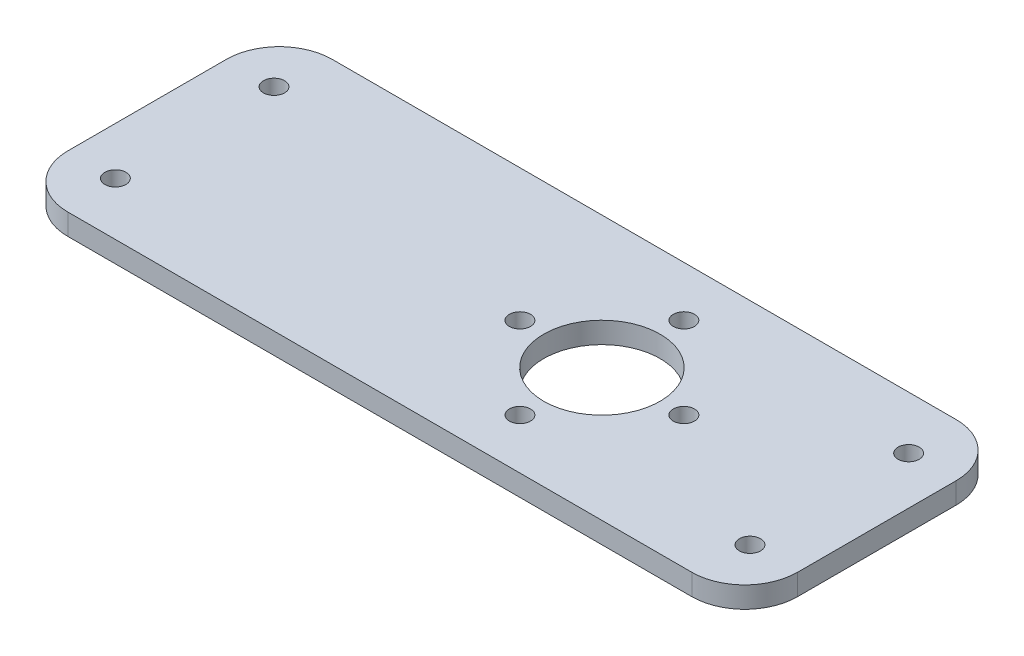
ISO-10303-21;
HEADER;
FILE_DESCRIPTION(('STEP AP214'),'2;1');
FILE_NAME('part.step','',(''),(''),'','','');
FILE_SCHEMA(('AUTOMOTIVE_DESIGN { 1 0 10303 214 1 1 1 1 }'));
ENDSEC;
DATA;
#1=APPLICATION_CONTEXT('core data for automotive mechanical design processes');
#2=APPLICATION_PROTOCOL_DEFINITION('international standard','automotive_design',2000,#1);
#3=PRODUCT_CONTEXT('',#1,'mechanical');
#4=PRODUCT('Part','Part','',(#3));
#5=PRODUCT_RELATED_PRODUCT_CATEGORY('part','',(#4));
#6=PRODUCT_DEFINITION_FORMATION('','',#4);
#7=PRODUCT_DEFINITION_CONTEXT('part definition',#1,'design');
#8=PRODUCT_DEFINITION('design','',#6,#7);
#9=PRODUCT_DEFINITION_SHAPE('','',#8);
#10=(LENGTH_UNIT() NAMED_UNIT(*) SI_UNIT(.MILLI.,.METRE.));
#11=(NAMED_UNIT(*) PLANE_ANGLE_UNIT() SI_UNIT($,.RADIAN.));
#12=(NAMED_UNIT(*) SI_UNIT($,.STERADIAN.) SOLID_ANGLE_UNIT());
#13=UNCERTAINTY_MEASURE_WITH_UNIT(LENGTH_MEASURE(1.E-05),#10,'distance_accuracy_value','');
#14=(GEOMETRIC_REPRESENTATION_CONTEXT(3) GLOBAL_UNCERTAINTY_ASSIGNED_CONTEXT((#13)) GLOBAL_UNIT_ASSIGNED_CONTEXT((#10,
#11,#12)) REPRESENTATION_CONTEXT('',''));
#15=CARTESIAN_POINT('',(0.,0.,0.));
#16=DIRECTION('',(0.,0.,1.));
#17=DIRECTION('',(1.,0.,0.));
#18=AXIS2_PLACEMENT_3D('',#15,#16,#17);
#19=CARTESIAN_POINT('',(0.,4.,25.));
#20=DIRECTION('',(0.,0.,1.));
#21=DIRECTION('',(1.,0.,0.));
#22=AXIS2_PLACEMENT_3D('',#19,#20,#21);
#23=PLANE('',#22);
#24=DIRECTION('',(-1.,0.,0.));
#25=VECTOR('',#24,1.);
#26=CARTESIAN_POINT('',(0.,4.,25.));
#27=LINE('',#26,#25);
#28=CARTESIAN_POINT('',(42.,4.,25.));
#29=VERTEX_POINT('',#28);
#30=CARTESIAN_POINT('',(-76.,4.,25.));
#31=VERTEX_POINT('',#30);
#32=EDGE_CURVE('E186',#29,#31,#27,.T.);
#33=ORIENTED_EDGE('',*,*,#32,.T.);
#34=DIRECTION('',(0.,1.,0.));
#35=VECTOR('',#34,1.);
#36=CARTESIAN_POINT('',(-76.,0.,25.));
#37=LINE('',#36,#35);
#38=CARTESIAN_POINT('',(-76.,0.,25.));
#39=VERTEX_POINT('',#38);
#40=EDGE_CURVE('E172',#31,#39,#37,.F.);
#41=ORIENTED_EDGE('',*,*,#40,.T.);
#42=DIRECTION('',(-1.,0.,0.));
#43=VECTOR('',#42,1.);
#44=CARTESIAN_POINT('',(0.,0.,25.));
#45=LINE('',#44,#43);
#46=CARTESIAN_POINT('',(42.,0.,25.));
#47=VERTEX_POINT('',#46);
#48=EDGE_CURVE('E138',#47,#39,#45,.T.);
#49=ORIENTED_EDGE('',*,*,#48,.F.);
#50=DIRECTION('',(0.,-1.,0.));
#51=VECTOR('',#50,1.);
#52=CARTESIAN_POINT('',(42.,4.,25.));
#53=LINE('',#52,#51);
#54=EDGE_CURVE('E169',#47,#29,#53,.F.);
#55=ORIENTED_EDGE('',*,*,#54,.T.);
#56=EDGE_LOOP('',(#33,#41,#49,#55));
#57=FACE_BOUND('',#56,.T.);
#58=ADVANCED_FACE('F40',(#57),#23,.T.);
#59=CARTESIAN_POINT('',(52.,4.,0.));
#60=DIRECTION('',(-1.,0.,0.));
#61=DIRECTION('',(0.,0.,1.));
#62=AXIS2_PLACEMENT_3D('',#59,#60,#61);
#63=PLANE('',#62);
#64=DIRECTION('',(0.,0.,-1.));
#65=VECTOR('',#64,1.);
#66=CARTESIAN_POINT('',(52.,4.,0.));
#67=LINE('',#66,#65);
#68=CARTESIAN_POINT('',(52.,4.,15.));
#69=VERTEX_POINT('',#68);
#70=CARTESIAN_POINT('',(52.,4.,-15.));
#71=VERTEX_POINT('',#70);
#72=EDGE_CURVE('E179',#69,#71,#67,.T.);
#73=ORIENTED_EDGE('',*,*,#72,.F.);
#74=DIRECTION('',(0.,-1.,0.));
#75=VECTOR('',#74,1.);
#76=CARTESIAN_POINT('',(52.,0.,15.));
#77=LINE('',#76,#75);
#78=CARTESIAN_POINT('',(52.,0.,15.));
#79=VERTEX_POINT('',#78);
#80=EDGE_CURVE('E11',#69,#79,#77,.T.);
#81=ORIENTED_EDGE('',*,*,#80,.T.);
#82=DIRECTION('',(0.,0.,-1.));
#83=VECTOR('',#82,1.);
#84=CARTESIAN_POINT('',(52.,0.,0.));
#85=LINE('',#84,#83);
#86=CARTESIAN_POINT('',(52.,0.,-15.));
#87=VERTEX_POINT('',#86);
#88=EDGE_CURVE('E131',#79,#87,#85,.T.);
#89=ORIENTED_EDGE('',*,*,#88,.T.);
#90=DIRECTION('',(0.,-1.,0.));
#91=VECTOR('',#90,1.);
#92=CARTESIAN_POINT('',(52.,4.,-15.));
#93=LINE('',#92,#91);
#94=EDGE_CURVE('E49',#87,#71,#93,.F.);
#95=ORIENTED_EDGE('',*,*,#94,.T.);
#96=EDGE_LOOP('',(#73,#81,#89,#95));
#97=FACE_BOUND('',#96,.T.);
#98=ADVANCED_FACE('F178',(#97),#63,.F.);
#99=CARTESIAN_POINT('',(15.5,4.,0.));
#100=DIRECTION('',(0.,-1.,0.));
#101=DIRECTION('',(0.,0.,-1.));
#102=AXIS2_PLACEMENT_3D('',#99,#100,#101);
#103=CYLINDRICAL_SURFACE('',#102,2.);
#104=CARTESIAN_POINT('',(15.5,4.,0.));
#105=DIRECTION('',(0.,1.,0.));
#106=DIRECTION('',(0.,0.,1.));
#107=AXIS2_PLACEMENT_3D('',#104,#105,#106);
#108=CIRCLE('',#107,2.);
#109=CARTESIAN_POINT('',(15.5,4.,2.));
#110=VERTEX_POINT('',#109);
#111=EDGE_CURVE('E192',#110,#110,#108,.T.);
#112=ORIENTED_EDGE('',*,*,#111,.T.);
#113=EDGE_LOOP('',(#112));
#114=FACE_BOUND('',#113,.T.);
#115=CARTESIAN_POINT('',(15.5,0.,0.));
#116=DIRECTION('',(0.,1.,0.));
#117=DIRECTION('',(0.,0.,1.));
#118=AXIS2_PLACEMENT_3D('',#115,#116,#117);
#119=CIRCLE('',#118,2.);
#120=CARTESIAN_POINT('',(15.5,0.,2.));
#121=VERTEX_POINT('',#120);
#122=EDGE_CURVE('E221',#121,#121,#119,.T.);
#123=ORIENTED_EDGE('',*,*,#122,.F.);
#124=EDGE_LOOP('',(#123));
#125=FACE_BOUND('',#124,.T.);
#126=ADVANCED_FACE('F273',(#114,#125),#103,.F.);
#127=CARTESIAN_POINT('',(0.,4.,0.));
#128=DIRECTION('',(0.,-1.,0.));
#129=DIRECTION('',(0.,0.,-1.));
#130=AXIS2_PLACEMENT_3D('',#127,#128,#129);
#131=CYLINDRICAL_SURFACE('',#130,10.9999999999999);
#132=CARTESIAN_POINT('',(0.,4.,0.));
#133=DIRECTION('',(0.,1.,0.));
#134=DIRECTION('',(0.,0.,1.));
#135=AXIS2_PLACEMENT_3D('',#132,#133,#134);
#136=CIRCLE('',#135,10.9999999999999);
#137=CARTESIAN_POINT('',(0.,4.,10.9999999999999));
#138=VERTEX_POINT('',#137);
#139=EDGE_CURVE('E266',#138,#138,#136,.T.);
#140=ORIENTED_EDGE('',*,*,#139,.T.);
#141=EDGE_LOOP('',(#140));
#142=FACE_BOUND('',#141,.T.);
#143=CARTESIAN_POINT('',(0.,0.,0.));
#144=DIRECTION('',(0.,1.,0.));
#145=DIRECTION('',(0.,0.,1.));
#146=AXIS2_PLACEMENT_3D('',#143,#144,#145);
#147=CIRCLE('',#146,10.9999999999999);
#148=CARTESIAN_POINT('',(0.,0.,10.9999999999999));
#149=VERTEX_POINT('',#148);
#150=EDGE_CURVE('E217',#149,#149,#147,.T.);
#151=ORIENTED_EDGE('',*,*,#150,.F.);
#152=EDGE_LOOP('',(#151));
#153=FACE_BOUND('',#152,.T.);
#154=ADVANCED_FACE('F300',(#142,#153),#131,.F.);
#155=CARTESIAN_POINT('',(43.,4.,-15.));
#156=DIRECTION('',(0.,-1.,0.));
#157=DIRECTION('',(0.,0.,-1.));
#158=AXIS2_PLACEMENT_3D('',#155,#156,#157);
#159=CYLINDRICAL_SURFACE('',#158,2.);
#160=CARTESIAN_POINT('',(43.,4.,-15.));
#161=DIRECTION('',(0.,1.,0.));
#162=DIRECTION('',(0.,0.,1.));
#163=AXIS2_PLACEMENT_3D('',#160,#161,#162);
#164=CIRCLE('',#163,2.);
#165=CARTESIAN_POINT('',(43.,4.,-13.));
#166=VERTEX_POINT('',#165);
#167=EDGE_CURVE('E262',#166,#166,#164,.T.);
#168=ORIENTED_EDGE('',*,*,#167,.T.);
#169=EDGE_LOOP('',(#168));
#170=FACE_BOUND('',#169,.T.);
#171=CARTESIAN_POINT('',(43.,0.,-15.));
#172=DIRECTION('',(0.,1.,0.));
#173=DIRECTION('',(0.,0.,1.));
#174=AXIS2_PLACEMENT_3D('',#171,#172,#173);
#175=CIRCLE('',#174,2.);
#176=CARTESIAN_POINT('',(43.,0.,-13.));
#177=VERTEX_POINT('',#176);
#178=EDGE_CURVE('E213',#177,#177,#175,.T.);
#179=ORIENTED_EDGE('',*,*,#178,.F.);
#180=EDGE_LOOP('',(#179));
#181=FACE_BOUND('',#180,.T.);
#182=ADVANCED_FACE('F303',(#170,#181),#159,.F.);
#183=CARTESIAN_POINT('',(43.,4.,15.));
#184=DIRECTION('',(0.,-1.,0.));
#185=DIRECTION('',(0.,0.,-1.));
#186=AXIS2_PLACEMENT_3D('',#183,#184,#185);
#187=CYLINDRICAL_SURFACE('',#186,2.);
#188=CARTESIAN_POINT('',(43.,4.,15.));
#189=DIRECTION('',(0.,1.,0.));
#190=DIRECTION('',(0.,0.,1.));
#191=AXIS2_PLACEMENT_3D('',#188,#189,#190);
#192=CIRCLE('',#191,2.);
#193=CARTESIAN_POINT('',(43.,4.,17.));
#194=VERTEX_POINT('',#193);
#195=EDGE_CURVE('E258',#194,#194,#192,.T.);
#196=ORIENTED_EDGE('',*,*,#195,.T.);
#197=EDGE_LOOP('',(#196));
#198=FACE_BOUND('',#197,.T.);
#199=CARTESIAN_POINT('',(43.,0.,15.));
#200=DIRECTION('',(0.,1.,0.));
#201=DIRECTION('',(0.,0.,1.));
#202=AXIS2_PLACEMENT_3D('',#199,#200,#201);
#203=CIRCLE('',#202,2.);
#204=CARTESIAN_POINT('',(43.,0.,17.));
#205=VERTEX_POINT('',#204);
#206=EDGE_CURVE('E209',#205,#205,#203,.T.);
#207=ORIENTED_EDGE('',*,*,#206,.F.);
#208=EDGE_LOOP('',(#207));
#209=FACE_BOUND('',#208,.T.);
#210=ADVANCED_FACE('F307',(#198,#209),#187,.F.);
#211=CARTESIAN_POINT('',(0.,4.,15.5));
#212=DIRECTION('',(0.,-1.,0.));
#213=DIRECTION('',(0.,0.,-1.));
#214=AXIS2_PLACEMENT_3D('',#211,#212,#213);
#215=CYLINDRICAL_SURFACE('',#214,2.);
#216=CARTESIAN_POINT('',(0.,4.,15.5));
#217=DIRECTION('',(0.,1.,0.));
#218=DIRECTION('',(0.,0.,1.));
#219=AXIS2_PLACEMENT_3D('',#216,#217,#218);
#220=CIRCLE('',#219,2.);
#221=CARTESIAN_POINT('',(0.,4.,17.5));
#222=VERTEX_POINT('',#221);
#223=EDGE_CURVE('E254',#222,#222,#220,.T.);
#224=ORIENTED_EDGE('',*,*,#223,.T.);
#225=EDGE_LOOP('',(#224));
#226=FACE_BOUND('',#225,.T.);
#227=CARTESIAN_POINT('',(0.,0.,15.5));
#228=DIRECTION('',(0.,1.,0.));
#229=DIRECTION('',(0.,0.,1.));
#230=AXIS2_PLACEMENT_3D('',#227,#228,#229);
#231=CIRCLE('',#230,2.);
#232=CARTESIAN_POINT('',(0.,0.,17.5));
#233=VERTEX_POINT('',#232);
#234=EDGE_CURVE('E205',#233,#233,#231,.T.);
#235=ORIENTED_EDGE('',*,*,#234,.F.);
#236=EDGE_LOOP('',(#235));
#237=FACE_BOUND('',#236,.T.);
#238=ADVANCED_FACE('F311',(#226,#237),#215,.F.);
#239=CARTESIAN_POINT('',(0.,4.,-15.5));
#240=DIRECTION('',(0.,-1.,0.));
#241=DIRECTION('',(0.,0.,-1.));
#242=AXIS2_PLACEMENT_3D('',#239,#240,#241);
#243=CYLINDRICAL_SURFACE('',#242,2.);
#244=CARTESIAN_POINT('',(0.,4.,-15.5));
#245=DIRECTION('',(0.,1.,0.));
#246=DIRECTION('',(0.,0.,1.));
#247=AXIS2_PLACEMENT_3D('',#244,#245,#246);
#248=CIRCLE('',#247,2.);
#249=CARTESIAN_POINT('',(0.,4.,-13.5));
#250=VERTEX_POINT('',#249);
#251=EDGE_CURVE('E136',#250,#250,#248,.T.);
#252=ORIENTED_EDGE('',*,*,#251,.T.);
#253=EDGE_LOOP('',(#252));
#254=FACE_BOUND('',#253,.T.);
#255=CARTESIAN_POINT('',(0.,0.,-15.5));
#256=DIRECTION('',(0.,1.,0.));
#257=DIRECTION('',(0.,0.,1.));
#258=AXIS2_PLACEMENT_3D('',#255,#256,#257);
#259=CIRCLE('',#258,2.);
#260=CARTESIAN_POINT('',(0.,0.,-13.5));
#261=VERTEX_POINT('',#260);
#262=EDGE_CURVE('E200',#261,#261,#259,.T.);
#263=ORIENTED_EDGE('',*,*,#262,.F.);
#264=EDGE_LOOP('',(#263));
#265=FACE_BOUND('',#264,.T.);
#266=ADVANCED_FACE('F315',(#254,#265),#243,.F.);
#267=CARTESIAN_POINT('',(-15.5,4.,0.));
#268=DIRECTION('',(0.,-1.,0.));
#269=DIRECTION('',(0.,0.,-1.));
#270=AXIS2_PLACEMENT_3D('',#267,#268,#269);
#271=CYLINDRICAL_SURFACE('',#270,2.);
#272=CARTESIAN_POINT('',(-15.5,4.,0.));
#273=DIRECTION('',(0.,1.,0.));
#274=DIRECTION('',(0.,0.,1.));
#275=AXIS2_PLACEMENT_3D('',#272,#273,#274);
#276=CIRCLE('',#275,2.);
#277=CARTESIAN_POINT('',(-15.5,4.,2.));
#278=VERTEX_POINT('',#277);
#279=EDGE_CURVE('E130',#278,#278,#276,.T.);
#280=ORIENTED_EDGE('',*,*,#279,.T.);
#281=EDGE_LOOP('',(#280));
#282=FACE_BOUND('',#281,.T.);
#283=CARTESIAN_POINT('',(-15.5,0.,0.));
#284=DIRECTION('',(0.,1.,0.));
#285=DIRECTION('',(0.,0.,1.));
#286=AXIS2_PLACEMENT_3D('',#283,#284,#285);
#287=CIRCLE('',#286,2.);
#288=CARTESIAN_POINT('',(-15.5,0.,2.));
#289=VERTEX_POINT('',#288);
#290=EDGE_CURVE('E196',#289,#289,#287,.T.);
#291=ORIENTED_EDGE('',*,*,#290,.F.);
#292=EDGE_LOOP('',(#291));
#293=FACE_BOUND('',#292,.T.);
#294=ADVANCED_FACE('F285',(#282,#293),#271,.F.);
#295=CARTESIAN_POINT('',(0.,4.,-25.));
#296=DIRECTION('',(0.,0.,1.));
#297=DIRECTION('',(1.,0.,0.));
#298=AXIS2_PLACEMENT_3D('',#295,#296,#297);
#299=PLANE('',#298);
#300=DIRECTION('',(-1.,0.,0.));
#301=VECTOR('',#300,1.);
#302=CARTESIAN_POINT('',(0.,0.,-25.));
#303=LINE('',#302,#301);
#304=CARTESIAN_POINT('',(42.,0.,-25.));
#305=VERTEX_POINT('',#304);
#306=CARTESIAN_POINT('',(-76.,0.,-25.));
#307=VERTEX_POINT('',#306);
#308=EDGE_CURVE('E118',#305,#307,#303,.T.);
#309=ORIENTED_EDGE('',*,*,#308,.T.);
#310=DIRECTION('',(0.,1.,0.));
#311=VECTOR('',#310,1.);
#312=CARTESIAN_POINT('',(-76.,4.,-25.));
#313=LINE('',#312,#311);
#314=CARTESIAN_POINT('',(-76.,4.,-25.));
#315=VERTEX_POINT('',#314);
#316=EDGE_CURVE('E123',#307,#315,#313,.T.);
#317=ORIENTED_EDGE('',*,*,#316,.T.);
#318=DIRECTION('',(-1.,0.,0.));
#319=VECTOR('',#318,1.);
#320=CARTESIAN_POINT('',(0.,4.,-25.));
#321=LINE('',#320,#319);
#322=CARTESIAN_POINT('',(42.,4.,-25.));
#323=VERTEX_POINT('',#322);
#324=EDGE_CURVE('E121',#323,#315,#321,.T.);
#325=ORIENTED_EDGE('',*,*,#324,.F.);
#326=DIRECTION('',(0.,-1.,0.));
#327=VECTOR('',#326,1.);
#328=CARTESIAN_POINT('',(42.,4.,-25.));
#329=LINE('',#328,#327);
#330=EDGE_CURVE('E109',#323,#305,#329,.T.);
#331=ORIENTED_EDGE('',*,*,#330,.T.);
#332=EDGE_LOOP('',(#309,#317,#325,#331));
#333=FACE_BOUND('',#332,.T.);
#334=ADVANCED_FACE('F116',(#333),#299,.F.);
#335=CARTESIAN_POINT('',(0.,4.,0.));
#336=DIRECTION('',(0.,1.,0.));
#337=DIRECTION('',(0.,0.,1.));
#338=AXIS2_PLACEMENT_3D('',#335,#336,#337);
#339=PLANE('',#338);
#340=CARTESIAN_POINT('',(-77.,4.,15.));
#341=DIRECTION('',(0.,1.,0.));
#342=DIRECTION('',(0.,0.,1.));
#343=AXIS2_PLACEMENT_3D('',#340,#341,#342);
#344=CIRCLE('',#343,2.);
#345=CARTESIAN_POINT('',(-77.,4.,17.));
#346=VERTEX_POINT('',#345);
#347=EDGE_CURVE('E461',#346,#346,#344,.T.);
#348=ORIENTED_EDGE('',*,*,#347,.F.);
#349=EDGE_LOOP('',(#348));
#350=FACE_BOUND('',#349,.T.);
#351=CARTESIAN_POINT('',(-77.,4.,-15.));
#352=DIRECTION('',(0.,1.,0.));
#353=DIRECTION('',(0.,0.,1.));
#354=AXIS2_PLACEMENT_3D('',#351,#352,#353);
#355=CIRCLE('',#354,2.);
#356=CARTESIAN_POINT('',(-77.,4.,-13.));
#357=VERTEX_POINT('',#356);
#358=EDGE_CURVE('E247',#357,#357,#355,.T.);
#359=ORIENTED_EDGE('',*,*,#358,.F.);
#360=EDGE_LOOP('',(#359));
#361=FACE_BOUND('',#360,.T.);
#362=ORIENTED_EDGE('',*,*,#324,.T.);
#363=CARTESIAN_POINT('',(-76.,4.,-15.));
#364=DIRECTION('',(0.,1.,0.));
#365=DIRECTION('',(0.,0.,1.));
#366=AXIS2_PLACEMENT_3D('',#363,#364,#365);
#367=CIRCLE('',#366,10.);
#368=CARTESIAN_POINT('',(-86.,4.,-15.));
#369=VERTEX_POINT('',#368);
#370=EDGE_CURVE('E153',#315,#369,#367,.T.);
#371=ORIENTED_EDGE('',*,*,#370,.T.);
#372=DIRECTION('',(0.,0.,-1.));
#373=VECTOR('',#372,1.);
#374=CARTESIAN_POINT('',(-86.,4.,-25.));
#375=LINE('',#374,#373);
#376=CARTESIAN_POINT('',(-86.,4.,15.));
#377=VERTEX_POINT('',#376);
#378=EDGE_CURVE('E238',#377,#369,#375,.T.);
#379=ORIENTED_EDGE('',*,*,#378,.F.);
#380=CARTESIAN_POINT('',(-76.,4.,15.));
#381=DIRECTION('',(0.,1.,0.));
#382=DIRECTION('',(0.,0.,1.));
#383=AXIS2_PLACEMENT_3D('',#380,#381,#382);
#384=CIRCLE('',#383,10.);
#385=EDGE_CURVE('E150',#377,#31,#384,.T.);
#386=ORIENTED_EDGE('',*,*,#385,.T.);
#387=ORIENTED_EDGE('',*,*,#32,.F.);
#388=CARTESIAN_POINT('',(42.,4.,15.));
#389=DIRECTION('',(0.,1.,0.));
#390=DIRECTION('',(0.,0.,1.));
#391=AXIS2_PLACEMENT_3D('',#388,#389,#390);
#392=CIRCLE('',#391,10.);
#393=EDGE_CURVE('E147',#29,#69,#392,.T.);
#394=ORIENTED_EDGE('',*,*,#393,.T.);
#395=ORIENTED_EDGE('',*,*,#72,.T.);
#396=CARTESIAN_POINT('',(42.,4.,-15.));
#397=DIRECTION('',(0.,1.,0.));
#398=DIRECTION('',(0.,0.,1.));
#399=AXIS2_PLACEMENT_3D('',#396,#397,#398);
#400=CIRCLE('',#399,10.);
#401=EDGE_CURVE('E144',#71,#323,#400,.T.);
#402=ORIENTED_EDGE('',*,*,#401,.T.);
#403=EDGE_LOOP('',(#362,#371,#379,#386,#387,#394,#395,#402));
#404=FACE_BOUND('',#403,.T.);
#405=ORIENTED_EDGE('',*,*,#279,.F.);
#406=EDGE_LOOP('',(#405));
#407=FACE_BOUND('',#406,.T.);
#408=ORIENTED_EDGE('',*,*,#251,.F.);
#409=EDGE_LOOP('',(#408));
#410=FACE_BOUND('',#409,.T.);
#411=ORIENTED_EDGE('',*,*,#223,.F.);
#412=EDGE_LOOP('',(#411));
#413=FACE_BOUND('',#412,.T.);
#414=ORIENTED_EDGE('',*,*,#195,.F.);
#415=EDGE_LOOP('',(#414));
#416=FACE_BOUND('',#415,.T.);
#417=ORIENTED_EDGE('',*,*,#167,.F.);
#418=EDGE_LOOP('',(#417));
#419=FACE_BOUND('',#418,.T.);
#420=ORIENTED_EDGE('',*,*,#139,.F.);
#421=EDGE_LOOP('',(#420));
#422=FACE_BOUND('',#421,.T.);
#423=ORIENTED_EDGE('',*,*,#111,.F.);
#424=EDGE_LOOP('',(#423));
#425=FACE_BOUND('',#424,.T.);
#426=ADVANCED_FACE('F181',(#350,#361,#404,#407,#410,#413,#416,#419,#422,#425),#339,.T.);
#427=CARTESIAN_POINT('',(0.,0.,0.));
#428=DIRECTION('',(0.,1.,0.));
#429=DIRECTION('',(0.,0.,1.));
#430=AXIS2_PLACEMENT_3D('',#427,#428,#429);
#431=PLANE('',#430);
#432=CARTESIAN_POINT('',(-77.,0.,15.));
#433=DIRECTION('',(0.,1.,0.));
#434=DIRECTION('',(0.,0.,1.));
#435=AXIS2_PLACEMENT_3D('',#432,#433,#434);
#436=CIRCLE('',#435,2.);
#437=CARTESIAN_POINT('',(-77.,0.,17.));
#438=VERTEX_POINT('',#437);
#439=EDGE_CURVE('E459',#438,#438,#436,.T.);
#440=ORIENTED_EDGE('',*,*,#439,.T.);
#441=EDGE_LOOP('',(#440));
#442=FACE_BOUND('',#441,.T.);
#443=CARTESIAN_POINT('',(-77.,0.,-15.));
#444=DIRECTION('',(0.,1.,0.));
#445=DIRECTION('',(0.,0.,1.));
#446=AXIS2_PLACEMENT_3D('',#443,#444,#445);
#447=CIRCLE('',#446,2.);
#448=CARTESIAN_POINT('',(-77.,0.,-13.));
#449=VERTEX_POINT('',#448);
#450=EDGE_CURVE('E241',#449,#449,#447,.T.);
#451=ORIENTED_EDGE('',*,*,#450,.T.);
#452=EDGE_LOOP('',(#451));
#453=FACE_BOUND('',#452,.T.);
#454=ORIENTED_EDGE('',*,*,#290,.T.);
#455=EDGE_LOOP('',(#454));
#456=FACE_BOUND('',#455,.T.);
#457=ORIENTED_EDGE('',*,*,#262,.T.);
#458=EDGE_LOOP('',(#457));
#459=FACE_BOUND('',#458,.T.);
#460=ORIENTED_EDGE('',*,*,#234,.T.);
#461=EDGE_LOOP('',(#460));
#462=FACE_BOUND('',#461,.T.);
#463=ORIENTED_EDGE('',*,*,#206,.T.);
#464=EDGE_LOOP('',(#463));
#465=FACE_BOUND('',#464,.T.);
#466=ORIENTED_EDGE('',*,*,#178,.T.);
#467=EDGE_LOOP('',(#466));
#468=FACE_BOUND('',#467,.T.);
#469=ORIENTED_EDGE('',*,*,#150,.T.);
#470=EDGE_LOOP('',(#469));
#471=FACE_BOUND('',#470,.T.);
#472=ORIENTED_EDGE('',*,*,#122,.T.);
#473=EDGE_LOOP('',(#472));
#474=FACE_BOUND('',#473,.T.);
#475=DIRECTION('',(0.,0.,-1.));
#476=VECTOR('',#475,1.);
#477=CARTESIAN_POINT('',(-86.,0.,-25.));
#478=LINE('',#477,#476);
#479=CARTESIAN_POINT('',(-86.,0.,15.));
#480=VERTEX_POINT('',#479);
#481=CARTESIAN_POINT('',(-86.,0.,-15.));
#482=VERTEX_POINT('',#481);
#483=EDGE_CURVE('E201',#480,#482,#478,.T.);
#484=ORIENTED_EDGE('',*,*,#483,.T.);
#485=CARTESIAN_POINT('',(-76.,0.,-15.));
#486=DIRECTION('',(0.,1.,0.));
#487=DIRECTION('',(0.,0.,1.));
#488=AXIS2_PLACEMENT_3D('',#485,#486,#487);
#489=CIRCLE('',#488,10.);
#490=EDGE_CURVE('E128',#482,#307,#489,.F.);
#491=ORIENTED_EDGE('',*,*,#490,.T.);
#492=ORIENTED_EDGE('',*,*,#308,.F.);
#493=CARTESIAN_POINT('',(42.,0.,-15.));
#494=DIRECTION('',(0.,1.,0.));
#495=DIRECTION('',(0.,0.,1.));
#496=AXIS2_PLACEMENT_3D('',#493,#494,#495);
#497=CIRCLE('',#496,10.);
#498=EDGE_CURVE('E56',#305,#87,#497,.F.);
#499=ORIENTED_EDGE('',*,*,#498,.T.);
#500=ORIENTED_EDGE('',*,*,#88,.F.);
#501=CARTESIAN_POINT('',(42.,0.,15.));
#502=DIRECTION('',(0.,1.,0.));
#503=DIRECTION('',(0.,0.,1.));
#504=AXIS2_PLACEMENT_3D('',#501,#502,#503);
#505=CIRCLE('',#504,10.);
#506=EDGE_CURVE('E64',#79,#47,#505,.F.);
#507=ORIENTED_EDGE('',*,*,#506,.T.);
#508=ORIENTED_EDGE('',*,*,#48,.T.);
#509=CARTESIAN_POINT('',(-76.,0.,15.));
#510=DIRECTION('',(0.,1.,0.));
#511=DIRECTION('',(0.,0.,1.));
#512=AXIS2_PLACEMENT_3D('',#509,#510,#511);
#513=CIRCLE('',#512,10.);
#514=EDGE_CURVE('E164',#39,#480,#513,.F.);
#515=ORIENTED_EDGE('',*,*,#514,.T.);
#516=EDGE_LOOP('',(#484,#491,#492,#499,#500,#507,#508,#515));
#517=FACE_BOUND('',#516,.T.);
#518=ADVANCED_FACE('F126',(#442,#453,#456,#459,#462,#465,#468,#471,#474,#517),#431,.F.);
#519=CARTESIAN_POINT('',(-86.,0.,-25.));
#520=DIRECTION('',(1.,0.,0.));
#521=DIRECTION('',(0.,0.,-1.));
#522=AXIS2_PLACEMENT_3D('',#519,#520,#521);
#523=PLANE('',#522);
#524=ORIENTED_EDGE('',*,*,#378,.T.);
#525=DIRECTION('',(0.,1.,0.));
#526=VECTOR('',#525,1.);
#527=CARTESIAN_POINT('',(-86.,0.,-15.));
#528=LINE('',#527,#526);
#529=EDGE_CURVE('E111',#369,#482,#528,.F.);
#530=ORIENTED_EDGE('',*,*,#529,.T.);
#531=ORIENTED_EDGE('',*,*,#483,.F.);
#532=DIRECTION('',(0.,1.,0.));
#533=VECTOR('',#532,1.);
#534=CARTESIAN_POINT('',(-86.,4.,15.));
#535=LINE('',#534,#533);
#536=EDGE_CURVE('E156',#480,#377,#535,.T.);
#537=ORIENTED_EDGE('',*,*,#536,.T.);
#538=EDGE_LOOP('',(#524,#530,#531,#537));
#539=FACE_BOUND('',#538,.T.);
#540=ADVANCED_FACE('F237',(#539),#523,.F.);
#541=CARTESIAN_POINT('',(-77.,0.,-15.));
#542=DIRECTION('',(0.,1.,0.));
#543=DIRECTION('',(0.,0.,1.));
#544=AXIS2_PLACEMENT_3D('',#541,#542,#543);
#545=CYLINDRICAL_SURFACE('',#544,2.);
#546=ORIENTED_EDGE('',*,*,#450,.F.);
#547=EDGE_LOOP('',(#546));
#548=FACE_BOUND('',#547,.T.);
#549=ORIENTED_EDGE('',*,*,#358,.T.);
#550=EDGE_LOOP('',(#549));
#551=FACE_BOUND('',#550,.T.);
#552=ADVANCED_FACE('F361',(#548,#551),#545,.F.);
#553=CARTESIAN_POINT('',(-77.,0.,15.));
#554=DIRECTION('',(0.,1.,0.));
#555=DIRECTION('',(0.,0.,1.));
#556=AXIS2_PLACEMENT_3D('',#553,#554,#555);
#557=CYLINDRICAL_SURFACE('',#556,2.);
#558=ORIENTED_EDGE('',*,*,#439,.F.);
#559=EDGE_LOOP('',(#558));
#560=FACE_BOUND('',#559,.T.);
#561=ORIENTED_EDGE('',*,*,#347,.T.);
#562=EDGE_LOOP('',(#561));
#563=FACE_BOUND('',#562,.T.);
#564=ADVANCED_FACE('F326',(#560,#563),#557,.F.);
#565=CARTESIAN_POINT('',(-76.,4.,-15.));
#566=DIRECTION('',(0.,1.,0.));
#567=DIRECTION('',(0.,0.,1.));
#568=AXIS2_PLACEMENT_3D('',#565,#566,#567);
#569=CYLINDRICAL_SURFACE('',#568,10.);
#570=ORIENTED_EDGE('',*,*,#490,.F.);
#571=ORIENTED_EDGE('',*,*,#529,.F.);
#572=ORIENTED_EDGE('',*,*,#370,.F.);
#573=ORIENTED_EDGE('',*,*,#316,.F.);
#574=EDGE_LOOP('',(#570,#571,#572,#573));
#575=FACE_BOUND('',#574,.T.);
#576=ADVANCED_FACE('F323',(#575),#569,.T.);
#577=CARTESIAN_POINT('',(-76.,0.,15.));
#578=DIRECTION('',(0.,-1.,0.));
#579=DIRECTION('',(0.,0.,-1.));
#580=AXIS2_PLACEMENT_3D('',#577,#578,#579);
#581=CYLINDRICAL_SURFACE('',#580,10.);
#582=ORIENTED_EDGE('',*,*,#514,.F.);
#583=ORIENTED_EDGE('',*,*,#40,.F.);
#584=ORIENTED_EDGE('',*,*,#385,.F.);
#585=ORIENTED_EDGE('',*,*,#536,.F.);
#586=EDGE_LOOP('',(#582,#583,#584,#585));
#587=FACE_BOUND('',#586,.T.);
#588=ADVANCED_FACE('F233',(#587),#581,.T.);
#589=CARTESIAN_POINT('',(42.,4.,15.));
#590=DIRECTION('',(0.,1.,0.));
#591=DIRECTION('',(0.,0.,1.));
#592=AXIS2_PLACEMENT_3D('',#589,#590,#591);
#593=CYLINDRICAL_SURFACE('',#592,10.);
#594=ORIENTED_EDGE('',*,*,#393,.F.);
#595=ORIENTED_EDGE('',*,*,#54,.F.);
#596=ORIENTED_EDGE('',*,*,#506,.F.);
#597=ORIENTED_EDGE('',*,*,#80,.F.);
#598=EDGE_LOOP('',(#594,#595,#596,#597));
#599=FACE_BOUND('',#598,.T.);
#600=ADVANCED_FACE('F329',(#599),#593,.T.);
#601=CARTESIAN_POINT('',(42.,4.,-15.));
#602=DIRECTION('',(0.,-1.,0.));
#603=DIRECTION('',(0.,0.,-1.));
#604=AXIS2_PLACEMENT_3D('',#601,#602,#603);
#605=CYLINDRICAL_SURFACE('',#604,10.);
#606=ORIENTED_EDGE('',*,*,#401,.F.);
#607=ORIENTED_EDGE('',*,*,#94,.F.);
#608=ORIENTED_EDGE('',*,*,#498,.F.);
#609=ORIENTED_EDGE('',*,*,#330,.F.);
#610=EDGE_LOOP('',(#606,#607,#608,#609));
#611=FACE_BOUND('',#610,.T.);
#612=ADVANCED_FACE('F42',(#611),#605,.T.);
#613=CLOSED_SHELL('',(#58,#98,#126,#154,#182,#210,#238,#266,#294,#334,#426,#518,#540,#552,#564,
#576,#588,#600,#612));
#614=MANIFOLD_SOLID_BREP('B2',#613);
#615=ADVANCED_BREP_SHAPE_REPRESENTATION('',(#18,#614),#14);
#616=SHAPE_DEFINITION_REPRESENTATION(#9,#615);
ENDSEC;
END-ISO-10303-21;
